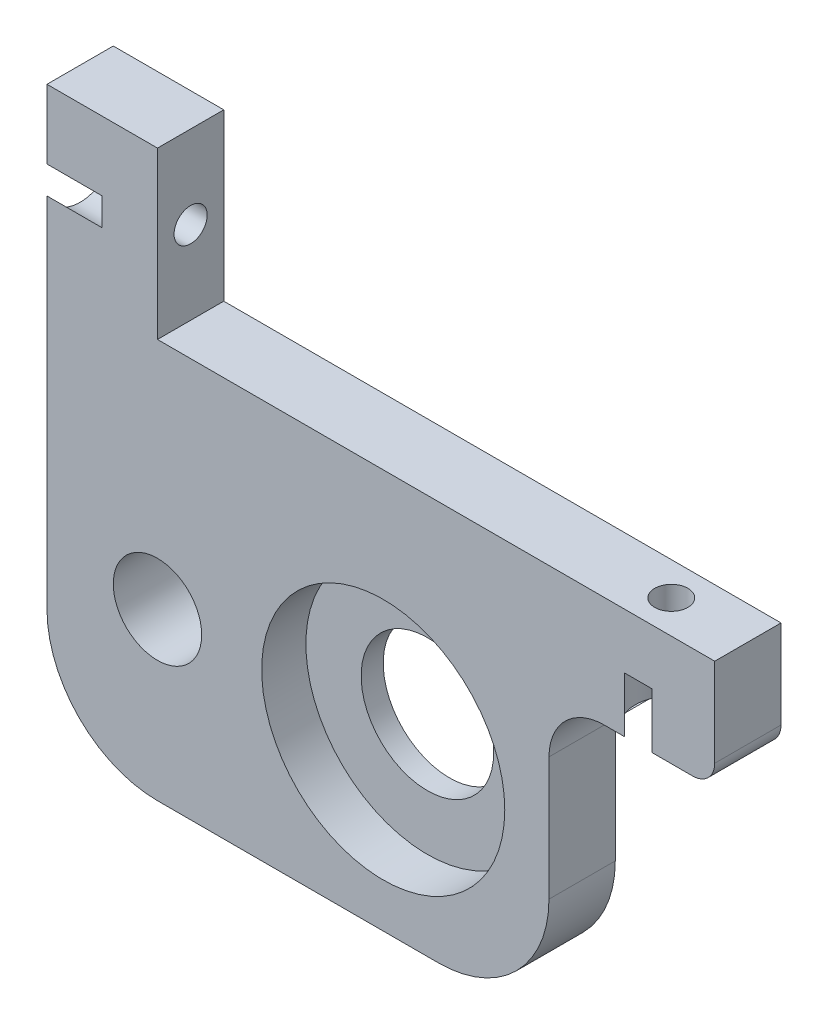
ISO-10303-21;
HEADER;
FILE_DESCRIPTION(('STEP AP214'),'2;1');
FILE_NAME('part.step','',(''),(''),'','','');
FILE_SCHEMA(('AUTOMOTIVE_DESIGN { 1 0 10303 214 1 1 1 1 }'));
ENDSEC;
DATA;
#1=APPLICATION_CONTEXT('core data for automotive mechanical design processes');
#2=APPLICATION_PROTOCOL_DEFINITION('international standard','automotive_design',2000,#1);
#3=PRODUCT_CONTEXT('',#1,'mechanical');
#4=PRODUCT('Part','Part','',(#3));
#5=PRODUCT_RELATED_PRODUCT_CATEGORY('part','',(#4));
#6=PRODUCT_DEFINITION_FORMATION('','',#4);
#7=PRODUCT_DEFINITION_CONTEXT('part definition',#1,'design');
#8=PRODUCT_DEFINITION('design','',#6,#7);
#9=PRODUCT_DEFINITION_SHAPE('','',#8);
#10=(LENGTH_UNIT() NAMED_UNIT(*) SI_UNIT(.MILLI.,.METRE.));
#11=(NAMED_UNIT(*) PLANE_ANGLE_UNIT() SI_UNIT($,.RADIAN.));
#12=(NAMED_UNIT(*) SI_UNIT($,.STERADIAN.) SOLID_ANGLE_UNIT());
#13=UNCERTAINTY_MEASURE_WITH_UNIT(LENGTH_MEASURE(1.E-05),#10,'distance_accuracy_value','');
#14=(GEOMETRIC_REPRESENTATION_CONTEXT(3) GLOBAL_UNCERTAINTY_ASSIGNED_CONTEXT((#13)) GLOBAL_UNIT_ASSIGNED_CONTEXT((#10,
#11,#12)) REPRESENTATION_CONTEXT('',''));
#15=CARTESIAN_POINT('',(0.,0.,0.));
#16=DIRECTION('',(0.,0.,1.));
#17=DIRECTION('',(1.,0.,0.));
#18=AXIS2_PLACEMENT_3D('',#15,#16,#17);
#19=CARTESIAN_POINT('',(-2.,-10.,6.));
#20=DIRECTION('',(0.,-1.,0.));
#21=DIRECTION('',(1.,0.,0.));
#22=AXIS2_PLACEMENT_3D('',#19,#20,#21);
#23=PLANE('',#22);
#24=CARTESIAN_POINT('',(-6.93,-10.,3.));
#25=DIRECTION('',(0.,-1.,0.));
#26=DIRECTION('',(1.,0.,0.));
#27=AXIS2_PLACEMENT_3D('',#24,#25,#26);
#28=CIRCLE('',#27,3.25);
#29=CARTESIAN_POINT('',(-8.18000000000001,-10.,6.));
#30=VERTEX_POINT('',#29);
#31=CARTESIAN_POINT('',(-9.99999999999999,-10.,4.06658333007789));
#32=VERTEX_POINT('',#31);
#33=EDGE_CURVE('E267',#30,#32,#28,.T.);
#34=ORIENTED_EDGE('',*,*,#33,.F.);
#35=DIRECTION('',(-1.,0.,0.));
#36=VECTOR('',#35,1.);
#37=CARTESIAN_POINT('',(-2.,-10.,6.));
#38=LINE('',#37,#36);
#39=CARTESIAN_POINT('',(-9.99999999999999,-10.,6.));
#40=VERTEX_POINT('',#39);
#41=EDGE_CURVE('E284',#30,#40,#38,.T.);
#42=ORIENTED_EDGE('',*,*,#41,.T.);
#43=DIRECTION('',(0.,0.,-1.));
#44=VECTOR('',#43,1.);
#45=CARTESIAN_POINT('',(-9.99999999999999,-10.,6.));
#46=LINE('',#45,#44);
#47=EDGE_CURVE('E371',#40,#32,#46,.T.);
#48=ORIENTED_EDGE('',*,*,#47,.T.);
#49=EDGE_LOOP('',(#34,#42,#48));
#50=FACE_BOUND('',#49,.T.);
#51=ADVANCED_FACE('F113',(#50),#23,.T.);
#52=CARTESIAN_POINT('',(-9.99999999999999,-10.,1.93341666992211));
#53=VERTEX_POINT('',#52);
#54=CARTESIAN_POINT('',(-8.18,-10.,0.));
#55=VERTEX_POINT('',#54);
#56=EDGE_CURVE('E265',#53,#55,#28,.T.);
#57=ORIENTED_EDGE('',*,*,#56,.F.);
#58=CARTESIAN_POINT('',(-9.99999999999999,-10.,0.));
#59=VERTEX_POINT('',#58);
#60=EDGE_CURVE('E370',#53,#59,#46,.T.);
#61=ORIENTED_EDGE('',*,*,#60,.T.);
#62=DIRECTION('',(-1.,0.,0.));
#63=VECTOR('',#62,1.);
#64=CARTESIAN_POINT('',(-2.,-10.,0.));
#65=LINE('',#64,#63);
#66=EDGE_CURVE('E324',#55,#59,#65,.T.);
#67=ORIENTED_EDGE('',*,*,#66,.F.);
#68=EDGE_LOOP('',(#57,#61,#67));
#69=FACE_BOUND('',#68,.T.);
#70=ADVANCED_FACE('F467',(#69),#23,.T.);
#71=CARTESIAN_POINT('',(-6.93,-36.15,3.));
#72=DIRECTION('',(0.,1.,0.));
#73=DIRECTION('',(0.,0.,1.));
#74=AXIS2_PLACEMENT_3D('',#71,#72,#73);
#75=CYLINDRICAL_SURFACE('',#74,1.5);
#76=CARTESIAN_POINT('',(-6.93,0.,3.));
#77=DIRECTION('',(0.,1.,0.));
#78=DIRECTION('',(0.,0.,1.));
#79=AXIS2_PLACEMENT_3D('',#76,#77,#78);
#80=CIRCLE('',#79,1.5);
#81=CARTESIAN_POINT('',(-6.93,0.,4.5));
#82=VERTEX_POINT('',#81);
#83=EDGE_CURVE('E412',#82,#82,#80,.T.);
#84=ORIENTED_EDGE('',*,*,#83,.T.);
#85=EDGE_LOOP('',(#84));
#86=FACE_BOUND('',#85,.T.);
#87=CARTESIAN_POINT('',(-6.93,-5.,3.));
#88=DIRECTION('',(0.,-1.,0.));
#89=DIRECTION('',(1.,0.,0.));
#90=AXIS2_PLACEMENT_3D('',#87,#88,#89);
#91=CIRCLE('',#90,1.5);
#92=CARTESIAN_POINT('',(-5.42999999999999,-5.,3.));
#93=VERTEX_POINT('',#92);
#94=EDGE_CURVE('E117',#93,#93,#91,.F.);
#95=ORIENTED_EDGE('',*,*,#94,.F.);
#96=EDGE_LOOP('',(#95));
#97=FACE_BOUND('',#96,.T.);
#98=ADVANCED_FACE('F534',(#86,#97),#75,.F.);
#99=CARTESIAN_POINT('',(-60.43,-26.15,6.));
#100=DIRECTION('',(-1.,0.,0.));
#101=DIRECTION('',(0.,0.,1.));
#102=AXIS2_PLACEMENT_3D('',#99,#100,#101);
#103=PLANE('',#102);
#104=CARTESIAN_POINT('',(-60.43,7.49999999999998,3.));
#105=DIRECTION('',(-1.,0.,0.));
#106=DIRECTION('',(0.,0.,1.));
#107=AXIS2_PLACEMENT_3D('',#104,#105,#106);
#108=CIRCLE('',#107,3.25);
#109=CARTESIAN_POINT('',(-60.43,8.74999999999998,6.));
#110=VERTEX_POINT('',#109);
#111=CARTESIAN_POINT('',(-60.43,8.74999999999997,0.));
#112=VERTEX_POINT('',#111);
#113=EDGE_CURVE('E394',#110,#112,#108,.T.);
#114=ORIENTED_EDGE('',*,*,#113,.F.);
#115=DIRECTION('',(0.,1.,0.));
#116=VECTOR('',#115,1.);
#117=CARTESIAN_POINT('',(-60.43,-26.15,6.));
#118=LINE('',#117,#116);
#119=CARTESIAN_POINT('',(-60.43,15.,6.));
#120=VERTEX_POINT('',#119);
#121=EDGE_CURVE('E303',#110,#120,#118,.T.);
#122=ORIENTED_EDGE('',*,*,#121,.T.);
#123=DIRECTION('',(0.,0.,-1.));
#124=VECTOR('',#123,1.);
#125=CARTESIAN_POINT('',(-60.43,15.,6.));
#126=LINE('',#125,#124);
#127=CARTESIAN_POINT('',(-60.43,15.,0.));
#128=VERTEX_POINT('',#127);
#129=EDGE_CURVE('E358',#120,#128,#126,.T.);
#130=ORIENTED_EDGE('',*,*,#129,.T.);
#131=DIRECTION('',(0.,1.,0.));
#132=VECTOR('',#131,1.);
#133=CARTESIAN_POINT('',(-60.43,-26.15,0.));
#134=LINE('',#133,#132);
#135=EDGE_CURVE('E342',#112,#128,#134,.T.);
#136=ORIENTED_EDGE('',*,*,#135,.F.);
#137=EDGE_LOOP('',(#114,#122,#130,#136));
#138=FACE_BOUND('',#137,.T.);
#139=ADVANCED_FACE('F514',(#138),#103,.T.);
#140=CARTESIAN_POINT('',(-60.43,7.49999999999995,3.));
#141=DIRECTION('',(1.,0.,0.));
#142=DIRECTION('',(0.,0.,-1.));
#143=AXIS2_PLACEMENT_3D('',#140,#141,#142);
#144=CYLINDRICAL_SURFACE('',#143,1.5);
#145=CARTESIAN_POINT('',(-50.43,7.49999999999995,3.));
#146=DIRECTION('',(1.,0.,0.));
#147=DIRECTION('',(0.,0.,-1.));
#148=AXIS2_PLACEMENT_3D('',#145,#146,#147);
#149=CIRCLE('',#148,1.5);
#150=CARTESIAN_POINT('',(-50.43,7.49999999999995,1.5));
#151=VERTEX_POINT('',#150);
#152=EDGE_CURVE('E409',#151,#151,#149,.T.);
#153=ORIENTED_EDGE('',*,*,#152,.T.);
#154=EDGE_LOOP('',(#153));
#155=FACE_BOUND('',#154,.T.);
#156=CARTESIAN_POINT('',(-55.43,7.49999999999995,3.));
#157=DIRECTION('',(-1.,0.,0.));
#158=DIRECTION('',(0.,0.,1.));
#159=AXIS2_PLACEMENT_3D('',#156,#157,#158);
#160=CIRCLE('',#159,1.5);
#161=CARTESIAN_POINT('',(-55.43,7.49999999999995,4.5));
#162=VERTEX_POINT('',#161);
#163=EDGE_CURVE('E379',#162,#162,#160,.F.);
#164=ORIENTED_EDGE('',*,*,#163,.F.);
#165=EDGE_LOOP('',(#164));
#166=FACE_BOUND('',#165,.T.);
#167=ADVANCED_FACE('F749',(#155,#166),#144,.F.);
#168=CARTESIAN_POINT('',(-30.,-21.15,6.));
#169=DIRECTION('',(0.,0.,-1.));
#170=DIRECTION('',(-1.,0.,0.));
#171=AXIS2_PLACEMENT_3D('',#168,#169,#170);
#172=CYLINDRICAL_SURFACE('',#171,6.);
#173=CARTESIAN_POINT('',(-30.,-21.15,0.));
#174=DIRECTION('',(0.,0.,1.));
#175=DIRECTION('',(1.,0.,0.));
#176=AXIS2_PLACEMENT_3D('',#173,#174,#175);
#177=CIRCLE('',#176,6.);
#178=CARTESIAN_POINT('',(-24.,-21.15,0.));
#179=VERTEX_POINT('',#178);
#180=EDGE_CURVE('E318',#179,#179,#177,.T.);
#181=ORIENTED_EDGE('',*,*,#180,.F.);
#182=EDGE_LOOP('',(#181));
#183=FACE_BOUND('',#182,.T.);
#184=CARTESIAN_POINT('',(-30.,-21.15,2.));
#185=DIRECTION('',(0.,0.,1.));
#186=DIRECTION('',(1.,0.,0.));
#187=AXIS2_PLACEMENT_3D('',#184,#185,#186);
#188=CIRCLE('',#187,6.);
#189=CARTESIAN_POINT('',(-24.,-21.15,2.));
#190=VERTEX_POINT('',#189);
#191=EDGE_CURVE('E375',#190,#190,#188,.T.);
#192=ORIENTED_EDGE('',*,*,#191,.T.);
#193=EDGE_LOOP('',(#192));
#194=FACE_BOUND('',#193,.T.);
#195=ADVANCED_FACE('F556',(#183,#194),#172,.F.);
#196=CARTESIAN_POINT('',(-25.,-26.15,6.));
#197=DIRECTION('',(0.,0.,1.));
#198=DIRECTION('',(1.,0.,0.));
#199=AXIS2_PLACEMENT_3D('',#196,#197,#198);
#200=PLANE('',#199);
#201=DIRECTION('',(0.,-1.,0.));
#202=VECTOR('',#201,1.);
#203=CARTESIAN_POINT('',(-8.18,-5.00000000000001,6.));
#204=LINE('',#203,#202);
#205=CARTESIAN_POINT('',(-8.18,-5.00000000000001,6.));
#206=VERTEX_POINT('',#205);
#207=EDGE_CURVE('E278',#206,#30,#204,.T.);
#208=ORIENTED_EDGE('',*,*,#207,.F.);
#209=DIRECTION('',(1.,0.,0.));
#210=VECTOR('',#209,1.);
#211=CARTESIAN_POINT('',(-25.,-5.,6.));
#212=LINE('',#211,#210);
#213=CARTESIAN_POINT('',(-5.67999999999999,-5.00000000000001,6.));
#214=VERTEX_POINT('',#213);
#215=EDGE_CURVE('E277',#206,#214,#212,.T.);
#216=ORIENTED_EDGE('',*,*,#215,.T.);
#217=DIRECTION('',(0.,-1.,0.));
#218=VECTOR('',#217,1.);
#219=CARTESIAN_POINT('',(-5.67999999999999,-5.00000000000001,6.));
#220=LINE('',#219,#218);
#221=CARTESIAN_POINT('',(-5.67999999999999,-10.,6.));
#222=VERTEX_POINT('',#221);
#223=EDGE_CURVE('E259',#222,#214,#220,.F.);
#224=ORIENTED_EDGE('',*,*,#223,.F.);
#225=CARTESIAN_POINT('',(-2.,-10.,6.));
#226=VERTEX_POINT('',#225);
#227=EDGE_CURVE('E275',#226,#222,#38,.T.);
#228=ORIENTED_EDGE('',*,*,#227,.F.);
#229=CARTESIAN_POINT('',(-2.,-8.00000000000001,6.));
#230=DIRECTION('',(0.,0.,-1.));
#231=DIRECTION('',(-1.,0.,0.));
#232=AXIS2_PLACEMENT_3D('',#229,#230,#231);
#233=CIRCLE('',#232,2.);
#234=CARTESIAN_POINT('',(0.,-8.00000000000001,6.));
#235=VERTEX_POINT('',#234);
#236=EDGE_CURVE('E283',#235,#226,#233,.T.);
#237=ORIENTED_EDGE('',*,*,#236,.F.);
#238=DIRECTION('',(0.,-1.,0.));
#239=VECTOR('',#238,1.);
#240=CARTESIAN_POINT('',(0.,0.,6.));
#241=LINE('',#240,#239);
#242=CARTESIAN_POINT('',(0.,0.,6.));
#243=VERTEX_POINT('',#242);
#244=EDGE_CURVE('E286',#243,#235,#241,.T.);
#245=ORIENTED_EDGE('',*,*,#244,.F.);
#246=DIRECTION('',(1.,0.,0.));
#247=VECTOR('',#246,1.);
#248=CARTESIAN_POINT('',(-50.43,0.,6.));
#249=LINE('',#248,#247);
#250=CARTESIAN_POINT('',(-50.43,0.,6.));
#251=VERTEX_POINT('',#250);
#252=EDGE_CURVE('E294',#251,#243,#249,.T.);
#253=ORIENTED_EDGE('',*,*,#252,.F.);
#254=DIRECTION('',(0.,-1.,0.));
#255=VECTOR('',#254,1.);
#256=CARTESIAN_POINT('',(-50.43,15.,6.));
#257=LINE('',#256,#255);
#258=CARTESIAN_POINT('',(-50.43,15.,6.));
#259=VERTEX_POINT('',#258);
#260=EDGE_CURVE('E297',#259,#251,#257,.T.);
#261=ORIENTED_EDGE('',*,*,#260,.F.);
#262=DIRECTION('',(1.,0.,0.));
#263=VECTOR('',#262,1.);
#264=CARTESIAN_POINT('',(-60.43,15.,6.));
#265=LINE('',#264,#263);
#266=EDGE_CURVE('E300',#120,#259,#265,.T.);
#267=ORIENTED_EDGE('',*,*,#266,.F.);
#268=ORIENTED_EDGE('',*,*,#121,.F.);
#269=DIRECTION('',(-1.,0.,0.));
#270=VECTOR('',#269,1.);
#271=CARTESIAN_POINT('',(-55.43,8.74999999999998,6.));
#272=LINE('',#271,#270);
#273=CARTESIAN_POINT('',(-55.43,8.74999999999998,6.));
#274=VERTEX_POINT('',#273);
#275=EDGE_CURVE('E407',#274,#110,#272,.T.);
#276=ORIENTED_EDGE('',*,*,#275,.F.);
#277=DIRECTION('',(0.,-1.,0.));
#278=VECTOR('',#277,1.);
#279=CARTESIAN_POINT('',(-55.43,-26.15,6.));
#280=LINE('',#279,#278);
#281=CARTESIAN_POINT('',(-55.43,6.24999999999997,6.));
#282=VERTEX_POINT('',#281);
#283=EDGE_CURVE('E385',#274,#282,#280,.T.);
#284=ORIENTED_EDGE('',*,*,#283,.T.);
#285=DIRECTION('',(-1.,0.,0.));
#286=VECTOR('',#285,1.);
#287=CARTESIAN_POINT('',(-55.43,6.24999999999997,6.));
#288=LINE('',#287,#286);
#289=CARTESIAN_POINT('',(-60.43,6.24999999999997,6.));
#290=VERTEX_POINT('',#289);
#291=EDGE_CURVE('E405',#290,#282,#288,.F.);
#292=ORIENTED_EDGE('',*,*,#291,.F.);
#293=CARTESIAN_POINT('',(-60.43,-26.15,6.));
#294=VERTEX_POINT('',#293);
#295=EDGE_CURVE('E304',#294,#290,#118,.T.);
#296=ORIENTED_EDGE('',*,*,#295,.F.);
#297=CARTESIAN_POINT('',(-50.43,-26.15,6.));
#298=DIRECTION('',(0.,0.,-1.));
#299=DIRECTION('',(-1.,0.,0.));
#300=AXIS2_PLACEMENT_3D('',#297,#298,#299);
#301=CIRCLE('',#300,10.);
#302=CARTESIAN_POINT('',(-50.43,-36.15,6.));
#303=VERTEX_POINT('',#302);
#304=EDGE_CURVE('E307',#303,#294,#301,.T.);
#305=ORIENTED_EDGE('',*,*,#304,.F.);
#306=DIRECTION('',(-1.,0.,0.));
#307=VECTOR('',#306,1.);
#308=CARTESIAN_POINT('',(-25.,-36.15,6.));
#309=LINE('',#308,#307);
#310=CARTESIAN_POINT('',(-25.,-36.15,6.));
#311=VERTEX_POINT('',#310);
#312=EDGE_CURVE('E310',#311,#303,#309,.T.);
#313=ORIENTED_EDGE('',*,*,#312,.F.);
#314=CARTESIAN_POINT('',(-25.,-26.15,6.));
#315=DIRECTION('',(0.,0.,1.));
#316=DIRECTION('',(1.,0.,0.));
#317=AXIS2_PLACEMENT_3D('',#314,#315,#316);
#318=CIRCLE('',#317,10.);
#319=CARTESIAN_POINT('',(-15.,-26.15,6.));
#320=VERTEX_POINT('',#319);
#321=EDGE_CURVE('E352',#311,#320,#318,.T.);
#322=ORIENTED_EDGE('',*,*,#321,.T.);
#323=DIRECTION('',(0.,-1.,0.));
#324=VECTOR('',#323,1.);
#325=CARTESIAN_POINT('',(-15.,-15.,6.));
#326=LINE('',#325,#324);
#327=CARTESIAN_POINT('',(-15.,-15.,6.));
#328=VERTEX_POINT('',#327);
#329=EDGE_CURVE('E427',#328,#320,#326,.T.);
#330=ORIENTED_EDGE('',*,*,#329,.F.);
#331=CARTESIAN_POINT('',(-9.99999999999999,-15.,6.));
#332=DIRECTION('',(0.,0.,-1.));
#333=DIRECTION('',(-1.,0.,0.));
#334=AXIS2_PLACEMENT_3D('',#331,#332,#333);
#335=CIRCLE('',#334,5.);
#336=EDGE_CURVE('E288',#328,#40,#335,.T.);
#337=ORIENTED_EDGE('',*,*,#336,.T.);
#338=ORIENTED_EDGE('',*,*,#41,.F.);
#339=EDGE_LOOP('',(#208,#216,#224,#228,#237,#245,#253,#261,#267,#268,#276,#284,#292,#296,#305,
#313,#322,#330,#337,#338));
#340=FACE_BOUND('',#339,.T.);
#341=CARTESIAN_POINT('',(-30.,-21.15,6.));
#342=DIRECTION('',(0.,0.,1.));
#343=DIRECTION('',(1.,0.,0.));
#344=AXIS2_PLACEMENT_3D('',#341,#342,#343);
#345=CIRCLE('',#344,11.);
#346=CARTESIAN_POINT('',(-19.,-21.15,6.));
#347=VERTEX_POINT('',#346);
#348=EDGE_CURVE('E415',#347,#347,#345,.T.);
#349=ORIENTED_EDGE('',*,*,#348,.F.);
#350=EDGE_LOOP('',(#349));
#351=FACE_BOUND('',#350,.T.);
#352=CARTESIAN_POINT('',(-50.43,-21.15,6.));
#353=DIRECTION('',(0.,0.,1.));
#354=DIRECTION('',(1.,0.,0.));
#355=AXIS2_PLACEMENT_3D('',#352,#353,#354);
#356=CIRCLE('',#355,4.00000000000001);
#357=CARTESIAN_POINT('',(-46.43,-21.15,6.));
#358=VERTEX_POINT('',#357);
#359=EDGE_CURVE('E420',#358,#358,#356,.T.);
#360=ORIENTED_EDGE('',*,*,#359,.F.);
#361=EDGE_LOOP('',(#360));
#362=FACE_BOUND('',#361,.T.);
#363=ADVANCED_FACE('F272',(#340,#351,#362),#200,.T.);
#364=CARTESIAN_POINT('',(-25.,-26.15,0.));
#365=DIRECTION('',(0.,0.,1.));
#366=DIRECTION('',(1.,0.,0.));
#367=AXIS2_PLACEMENT_3D('',#364,#365,#366);
#368=PLANE('',#367);
#369=ORIENTED_EDGE('',*,*,#180,.T.);
#370=EDGE_LOOP('',(#369));
#371=FACE_BOUND('',#370,.T.);
#372=DIRECTION('',(1.,0.,0.));
#373=VECTOR('',#372,1.);
#374=CARTESIAN_POINT('',(-25.,-5.,0.));
#375=LINE('',#374,#373);
#376=CARTESIAN_POINT('',(-8.18,-5.00000000000001,0.));
#377=VERTEX_POINT('',#376);
#378=CARTESIAN_POINT('',(-5.67999999999999,-5.00000000000001,0.));
#379=VERTEX_POINT('',#378);
#380=EDGE_CURVE('E451',#377,#379,#375,.T.);
#381=ORIENTED_EDGE('',*,*,#380,.F.);
#382=DIRECTION('',(0.,-1.,0.));
#383=VECTOR('',#382,1.);
#384=CARTESIAN_POINT('',(-8.18,-5.00000000000001,0.));
#385=LINE('',#384,#383);
#386=EDGE_CURVE('E279',#377,#55,#385,.T.);
#387=ORIENTED_EDGE('',*,*,#386,.T.);
#388=ORIENTED_EDGE('',*,*,#66,.T.);
#389=CARTESIAN_POINT('',(-9.99999999999999,-15.,0.));
#390=DIRECTION('',(0.,0.,-1.));
#391=DIRECTION('',(-1.,0.,0.));
#392=AXIS2_PLACEMENT_3D('',#389,#390,#391);
#393=CIRCLE('',#392,5.);
#394=CARTESIAN_POINT('',(-15.,-15.,0.));
#395=VERTEX_POINT('',#394);
#396=EDGE_CURVE('E321',#395,#59,#393,.T.);
#397=ORIENTED_EDGE('',*,*,#396,.F.);
#398=DIRECTION('',(0.,-1.,0.));
#399=VECTOR('',#398,1.);
#400=CARTESIAN_POINT('',(-15.,-15.,0.));
#401=LINE('',#400,#399);
#402=CARTESIAN_POINT('',(-15.,-26.15,0.));
#403=VERTEX_POINT('',#402);
#404=EDGE_CURVE('E317',#395,#403,#401,.T.);
#405=ORIENTED_EDGE('',*,*,#404,.T.);
#406=CARTESIAN_POINT('',(-25.,-26.15,0.));
#407=DIRECTION('',(0.,0.,1.));
#408=DIRECTION('',(1.,0.,0.));
#409=AXIS2_PLACEMENT_3D('',#406,#407,#408);
#410=CIRCLE('',#409,10.);
#411=CARTESIAN_POINT('',(-25.,-36.15,0.));
#412=VERTEX_POINT('',#411);
#413=EDGE_CURVE('E314',#412,#403,#410,.T.);
#414=ORIENTED_EDGE('',*,*,#413,.F.);
#415=DIRECTION('',(-1.,0.,0.));
#416=VECTOR('',#415,1.);
#417=CARTESIAN_POINT('',(-25.,-36.15,0.));
#418=LINE('',#417,#416);
#419=CARTESIAN_POINT('',(-50.43,-36.15,0.));
#420=VERTEX_POINT('',#419);
#421=EDGE_CURVE('E349',#412,#420,#418,.T.);
#422=ORIENTED_EDGE('',*,*,#421,.T.);
#423=CARTESIAN_POINT('',(-50.43,-26.15,0.));
#424=DIRECTION('',(0.,0.,-1.));
#425=DIRECTION('',(-1.,0.,0.));
#426=AXIS2_PLACEMENT_3D('',#423,#424,#425);
#427=CIRCLE('',#426,10.);
#428=CARTESIAN_POINT('',(-60.43,-26.15,0.));
#429=VERTEX_POINT('',#428);
#430=EDGE_CURVE('E346',#420,#429,#427,.T.);
#431=ORIENTED_EDGE('',*,*,#430,.T.);
#432=CARTESIAN_POINT('',(-60.43,6.24999999999998,0.));
#433=VERTEX_POINT('',#432);
#434=EDGE_CURVE('E343',#429,#433,#134,.T.);
#435=ORIENTED_EDGE('',*,*,#434,.T.);
#436=DIRECTION('',(-1.,0.,0.));
#437=VECTOR('',#436,1.);
#438=CARTESIAN_POINT('',(-55.43,6.24999999999998,0.));
#439=LINE('',#438,#437);
#440=CARTESIAN_POINT('',(-55.43,6.24999999999998,0.));
#441=VERTEX_POINT('',#440);
#442=EDGE_CURVE('E138',#433,#441,#439,.F.);
#443=ORIENTED_EDGE('',*,*,#442,.T.);
#444=DIRECTION('',(0.,-1.,0.));
#445=VECTOR('',#444,1.);
#446=CARTESIAN_POINT('',(-55.43,-26.15,0.));
#447=LINE('',#446,#445);
#448=CARTESIAN_POINT('',(-55.43,8.74999999999997,0.));
#449=VERTEX_POINT('',#448);
#450=EDGE_CURVE('E381',#449,#441,#447,.T.);
#451=ORIENTED_EDGE('',*,*,#450,.F.);
#452=DIRECTION('',(-1.,0.,0.));
#453=VECTOR('',#452,1.);
#454=CARTESIAN_POINT('',(-55.43,8.74999999999997,0.));
#455=LINE('',#454,#453);
#456=EDGE_CURVE('E402',#449,#112,#455,.T.);
#457=ORIENTED_EDGE('',*,*,#456,.T.);
#458=ORIENTED_EDGE('',*,*,#135,.T.);
#459=DIRECTION('',(1.,0.,0.));
#460=VECTOR('',#459,1.);
#461=CARTESIAN_POINT('',(-60.43,15.,0.));
#462=LINE('',#461,#460);
#463=CARTESIAN_POINT('',(-50.43,15.,0.));
#464=VERTEX_POINT('',#463);
#465=EDGE_CURVE('E339',#128,#464,#462,.T.);
#466=ORIENTED_EDGE('',*,*,#465,.T.);
#467=DIRECTION('',(0.,-1.,0.));
#468=VECTOR('',#467,1.);
#469=CARTESIAN_POINT('',(-50.43,15.,0.));
#470=LINE('',#469,#468);
#471=CARTESIAN_POINT('',(-50.43,0.,0.));
#472=VERTEX_POINT('',#471);
#473=EDGE_CURVE('E336',#464,#472,#470,.T.);
#474=ORIENTED_EDGE('',*,*,#473,.T.);
#475=DIRECTION('',(1.,0.,0.));
#476=VECTOR('',#475,1.);
#477=CARTESIAN_POINT('',(-50.43,0.,0.));
#478=LINE('',#477,#476);
#479=CARTESIAN_POINT('',(0.,0.,0.));
#480=VERTEX_POINT('',#479);
#481=EDGE_CURVE('E333',#472,#480,#478,.T.);
#482=ORIENTED_EDGE('',*,*,#481,.T.);
#483=DIRECTION('',(0.,-1.,0.));
#484=VECTOR('',#483,1.);
#485=CARTESIAN_POINT('',(0.,0.,0.));
#486=LINE('',#485,#484);
#487=CARTESIAN_POINT('',(0.,-8.00000000000001,0.));
#488=VERTEX_POINT('',#487);
#489=EDGE_CURVE('E330',#480,#488,#486,.T.);
#490=ORIENTED_EDGE('',*,*,#489,.T.);
#491=CARTESIAN_POINT('',(-2.,-8.00000000000001,0.));
#492=DIRECTION('',(0.,0.,-1.));
#493=DIRECTION('',(-1.,0.,0.));
#494=AXIS2_PLACEMENT_3D('',#491,#492,#493);
#495=CIRCLE('',#494,2.);
#496=CARTESIAN_POINT('',(-2.,-10.,0.));
#497=VERTEX_POINT('',#496);
#498=EDGE_CURVE('E327',#488,#497,#495,.T.);
#499=ORIENTED_EDGE('',*,*,#498,.T.);
#500=CARTESIAN_POINT('',(-5.68,-10.,0.));
#501=VERTEX_POINT('',#500);
#502=EDGE_CURVE('E325',#497,#501,#65,.T.);
#503=ORIENTED_EDGE('',*,*,#502,.T.);
#504=DIRECTION('',(0.,-1.,0.));
#505=VECTOR('',#504,1.);
#506=CARTESIAN_POINT('',(-5.67999999999999,-5.00000000000001,0.));
#507=LINE('',#506,#505);
#508=EDGE_CURVE('E130',#501,#379,#507,.F.);
#509=ORIENTED_EDGE('',*,*,#508,.T.);
#510=EDGE_LOOP('',(#381,#387,#388,#397,#405,#414,#422,#431,#435,#443,#451,#457,#458,#466,#474,
#482,#490,#499,#503,#509));
#511=FACE_BOUND('',#510,.T.);
#512=CARTESIAN_POINT('',(-50.43,-21.15,0.));
#513=DIRECTION('',(0.,0.,1.));
#514=DIRECTION('',(1.,0.,0.));
#515=AXIS2_PLACEMENT_3D('',#512,#513,#514);
#516=CIRCLE('',#515,4.00000000000001);
#517=CARTESIAN_POINT('',(-46.43,-21.15,0.));
#518=VERTEX_POINT('',#517);
#519=EDGE_CURVE('E377',#518,#518,#516,.T.);
#520=ORIENTED_EDGE('',*,*,#519,.T.);
#521=EDGE_LOOP('',(#520));
#522=FACE_BOUND('',#521,.T.);
#523=ADVANCED_FACE('F460',(#371,#511,#522),#368,.F.);
#524=CARTESIAN_POINT('',(-25.,-26.15,6.));
#525=DIRECTION('',(0.,0.,-1.));
#526=DIRECTION('',(-1.,0.,0.));
#527=AXIS2_PLACEMENT_3D('',#524,#525,#526);
#528=CYLINDRICAL_SURFACE('',#527,10.);
#529=ORIENTED_EDGE('',*,*,#413,.T.);
#530=DIRECTION('',(0.,0.,-1.));
#531=VECTOR('',#530,1.);
#532=CARTESIAN_POINT('',(-15.,-26.15,6.));
#533=LINE('',#532,#531);
#534=EDGE_CURVE('E12',#320,#403,#533,.T.);
#535=ORIENTED_EDGE('',*,*,#534,.F.);
#536=ORIENTED_EDGE('',*,*,#321,.F.);
#537=DIRECTION('',(0.,0.,-1.));
#538=VECTOR('',#537,1.);
#539=CARTESIAN_POINT('',(-25.,-36.15,6.));
#540=LINE('',#539,#538);
#541=EDGE_CURVE('E313',#311,#412,#540,.T.);
#542=ORIENTED_EDGE('',*,*,#541,.T.);
#543=EDGE_LOOP('',(#529,#535,#536,#542));
#544=FACE_BOUND('',#543,.T.);
#545=ADVANCED_FACE('F115',(#544),#528,.T.);
#546=CARTESIAN_POINT('',(-15.,-15.,6.));
#547=DIRECTION('',(1.,0.,0.));
#548=DIRECTION('',(0.,1.,0.));
#549=AXIS2_PLACEMENT_3D('',#546,#547,#548);
#550=PLANE('',#549);
#551=ORIENTED_EDGE('',*,*,#404,.F.);
#552=DIRECTION('',(0.,0.,-1.));
#553=VECTOR('',#552,1.);
#554=CARTESIAN_POINT('',(-15.,-15.,6.));
#555=LINE('',#554,#553);
#556=EDGE_CURVE('E122',#328,#395,#555,.T.);
#557=ORIENTED_EDGE('',*,*,#556,.F.);
#558=ORIENTED_EDGE('',*,*,#329,.T.);
#559=ORIENTED_EDGE('',*,*,#534,.T.);
#560=EDGE_LOOP('',(#551,#557,#558,#559));
#561=FACE_BOUND('',#560,.T.);
#562=ADVANCED_FACE('F470',(#561),#550,.T.);
#563=CARTESIAN_POINT('',(-9.99999999999999,-15.,6.));
#564=DIRECTION('',(0.,0.,-1.));
#565=DIRECTION('',(-1.,0.,0.));
#566=AXIS2_PLACEMENT_3D('',#563,#564,#565);
#567=CYLINDRICAL_SURFACE('',#566,5.);
#568=ORIENTED_EDGE('',*,*,#396,.T.);
#569=ORIENTED_EDGE('',*,*,#60,.F.);
#570=DIRECTION('',(0.,0.,-1.));
#571=VECTOR('',#570,1.);
#572=CARTESIAN_POINT('',(-9.99999999999999,-10.,6.));
#573=LINE('',#572,#571);
#574=EDGE_CURVE('E439',#53,#32,#573,.F.);
#575=ORIENTED_EDGE('',*,*,#574,.T.);
#576=ORIENTED_EDGE('',*,*,#47,.F.);
#577=ORIENTED_EDGE('',*,*,#336,.F.);
#578=ORIENTED_EDGE('',*,*,#556,.T.);
#579=EDGE_LOOP('',(#568,#569,#575,#576,#577,#578));
#580=FACE_BOUND('',#579,.T.);
#581=ADVANCED_FACE('F437',(#580),#567,.F.);
#582=EDGE_CURVE('E256',#501,#222,#28,.T.);
#583=ORIENTED_EDGE('',*,*,#582,.F.);
#584=ORIENTED_EDGE('',*,*,#502,.F.);
#585=DIRECTION('',(0.,0.,-1.));
#586=VECTOR('',#585,1.);
#587=CARTESIAN_POINT('',(-2.,-10.,6.));
#588=LINE('',#587,#586);
#589=EDGE_CURVE('E282',#226,#497,#588,.T.);
#590=ORIENTED_EDGE('',*,*,#589,.F.);
#591=ORIENTED_EDGE('',*,*,#227,.T.);
#592=EDGE_LOOP('',(#583,#584,#590,#591));
#593=FACE_BOUND('',#592,.T.);
#594=ADVANCED_FACE('F281',(#593),#23,.T.);
#595=CARTESIAN_POINT('',(-2.,-8.00000000000001,6.));
#596=DIRECTION('',(0.,0.,-1.));
#597=DIRECTION('',(-1.,0.,0.));
#598=AXIS2_PLACEMENT_3D('',#595,#596,#597);
#599=CYLINDRICAL_SURFACE('',#598,2.);
#600=ORIENTED_EDGE('',*,*,#498,.F.);
#601=DIRECTION('',(0.,0.,-1.));
#602=VECTOR('',#601,1.);
#603=CARTESIAN_POINT('',(0.,-8.00000000000001,6.));
#604=LINE('',#603,#602);
#605=EDGE_CURVE('E367',#235,#488,#604,.T.);
#606=ORIENTED_EDGE('',*,*,#605,.F.);
#607=ORIENTED_EDGE('',*,*,#236,.T.);
#608=ORIENTED_EDGE('',*,*,#589,.T.);
#609=EDGE_LOOP('',(#600,#606,#607,#608));
#610=FACE_BOUND('',#609,.T.);
#611=ADVANCED_FACE('F493',(#610),#599,.T.);
#612=CARTESIAN_POINT('',(0.,0.,6.));
#613=DIRECTION('',(1.,0.,0.));
#614=DIRECTION('',(0.,0.,-1.));
#615=AXIS2_PLACEMENT_3D('',#612,#613,#614);
#616=PLANE('',#615);
#617=ORIENTED_EDGE('',*,*,#489,.F.);
#618=DIRECTION('',(0.,0.,-1.));
#619=VECTOR('',#618,1.);
#620=CARTESIAN_POINT('',(0.,0.,6.));
#621=LINE('',#620,#619);
#622=EDGE_CURVE('E365',#243,#480,#621,.T.);
#623=ORIENTED_EDGE('',*,*,#622,.F.);
#624=ORIENTED_EDGE('',*,*,#244,.T.);
#625=ORIENTED_EDGE('',*,*,#605,.T.);
#626=EDGE_LOOP('',(#617,#623,#624,#625));
#627=FACE_BOUND('',#626,.T.);
#628=ADVANCED_FACE('F497',(#627),#616,.T.);
#629=CARTESIAN_POINT('',(-50.43,0.,6.));
#630=DIRECTION('',(0.,1.,0.));
#631=DIRECTION('',(0.,0.,1.));
#632=AXIS2_PLACEMENT_3D('',#629,#630,#631);
#633=PLANE('',#632);
#634=ORIENTED_EDGE('',*,*,#83,.F.);
#635=EDGE_LOOP('',(#634));
#636=FACE_BOUND('',#635,.T.);
#637=ORIENTED_EDGE('',*,*,#481,.F.);
#638=DIRECTION('',(0.,0.,-1.));
#639=VECTOR('',#638,1.);
#640=CARTESIAN_POINT('',(-50.43,0.,6.));
#641=LINE('',#640,#639);
#642=EDGE_CURVE('E363',#251,#472,#641,.T.);
#643=ORIENTED_EDGE('',*,*,#642,.F.);
#644=ORIENTED_EDGE('',*,*,#252,.T.);
#645=ORIENTED_EDGE('',*,*,#622,.T.);
#646=EDGE_LOOP('',(#637,#643,#644,#645));
#647=FACE_BOUND('',#646,.T.);
#648=ADVANCED_FACE('F500',(#636,#647),#633,.T.);
#649=CARTESIAN_POINT('',(-50.43,15.,6.));
#650=DIRECTION('',(1.,0.,0.));
#651=DIRECTION('',(0.,1.,0.));
#652=AXIS2_PLACEMENT_3D('',#649,#650,#651);
#653=PLANE('',#652);
#654=ORIENTED_EDGE('',*,*,#152,.F.);
#655=EDGE_LOOP('',(#654));
#656=FACE_BOUND('',#655,.T.);
#657=ORIENTED_EDGE('',*,*,#473,.F.);
#658=DIRECTION('',(0.,0.,-1.));
#659=VECTOR('',#658,1.);
#660=CARTESIAN_POINT('',(-50.43,15.,6.));
#661=LINE('',#660,#659);
#662=EDGE_CURVE('E361',#259,#464,#661,.T.);
#663=ORIENTED_EDGE('',*,*,#662,.F.);
#664=ORIENTED_EDGE('',*,*,#260,.T.);
#665=ORIENTED_EDGE('',*,*,#642,.T.);
#666=EDGE_LOOP('',(#657,#663,#664,#665));
#667=FACE_BOUND('',#666,.T.);
#668=ADVANCED_FACE('F505',(#656,#667),#653,.T.);
#669=CARTESIAN_POINT('',(-60.43,15.,6.));
#670=DIRECTION('',(0.,1.,0.));
#671=DIRECTION('',(0.,0.,1.));
#672=AXIS2_PLACEMENT_3D('',#669,#670,#671);
#673=PLANE('',#672);
#674=ORIENTED_EDGE('',*,*,#465,.F.);
#675=ORIENTED_EDGE('',*,*,#129,.F.);
#676=ORIENTED_EDGE('',*,*,#266,.T.);
#677=ORIENTED_EDGE('',*,*,#662,.T.);
#678=EDGE_LOOP('',(#674,#675,#676,#677));
#679=FACE_BOUND('',#678,.T.);
#680=ADVANCED_FACE('F508',(#679),#673,.T.);
#681=EDGE_CURVE('E397',#433,#290,#108,.T.);
#682=ORIENTED_EDGE('',*,*,#681,.F.);
#683=ORIENTED_EDGE('',*,*,#434,.F.);
#684=DIRECTION('',(0.,0.,-1.));
#685=VECTOR('',#684,1.);
#686=CARTESIAN_POINT('',(-60.43,-26.15,6.));
#687=LINE('',#686,#685);
#688=EDGE_CURVE('E356',#294,#429,#687,.T.);
#689=ORIENTED_EDGE('',*,*,#688,.F.);
#690=ORIENTED_EDGE('',*,*,#295,.T.);
#691=EDGE_LOOP('',(#682,#683,#689,#690));
#692=FACE_BOUND('',#691,.T.);
#693=ADVANCED_FACE('F484',(#692),#103,.T.);
#694=CARTESIAN_POINT('',(-50.43,-26.15,6.));
#695=DIRECTION('',(0.,0.,-1.));
#696=DIRECTION('',(-1.,0.,0.));
#697=AXIS2_PLACEMENT_3D('',#694,#695,#696);
#698=CYLINDRICAL_SURFACE('',#697,10.);
#699=ORIENTED_EDGE('',*,*,#430,.F.);
#700=DIRECTION('',(0.,0.,-1.));
#701=VECTOR('',#700,1.);
#702=CARTESIAN_POINT('',(-50.43,-36.15,6.));
#703=LINE('',#702,#701);
#704=EDGE_CURVE('E354',#303,#420,#703,.T.);
#705=ORIENTED_EDGE('',*,*,#704,.F.);
#706=ORIENTED_EDGE('',*,*,#304,.T.);
#707=ORIENTED_EDGE('',*,*,#688,.T.);
#708=EDGE_LOOP('',(#699,#705,#706,#707));
#709=FACE_BOUND('',#708,.T.);
#710=ADVANCED_FACE('F481',(#709),#698,.T.);
#711=CARTESIAN_POINT('',(-25.,-36.15,6.));
#712=DIRECTION('',(0.,-1.,0.));
#713=DIRECTION('',(0.,0.,-1.));
#714=AXIS2_PLACEMENT_3D('',#711,#712,#713);
#715=PLANE('',#714);
#716=ORIENTED_EDGE('',*,*,#421,.F.);
#717=ORIENTED_EDGE('',*,*,#541,.F.);
#718=ORIENTED_EDGE('',*,*,#312,.T.);
#719=ORIENTED_EDGE('',*,*,#704,.T.);
#720=EDGE_LOOP('',(#716,#717,#718,#719));
#721=FACE_BOUND('',#720,.T.);
#722=ADVANCED_FACE('F476',(#721),#715,.T.);
#723=CARTESIAN_POINT('',(-50.43,-21.15,6.));
#724=DIRECTION('',(0.,0.,-1.));
#725=DIRECTION('',(-1.,0.,0.));
#726=AXIS2_PLACEMENT_3D('',#723,#724,#725);
#727=CYLINDRICAL_SURFACE('',#726,4.00000000000001);
#728=ORIENTED_EDGE('',*,*,#359,.T.);
#729=EDGE_LOOP('',(#728));
#730=FACE_BOUND('',#729,.T.);
#731=ORIENTED_EDGE('',*,*,#519,.F.);
#732=EDGE_LOOP('',(#731));
#733=FACE_BOUND('',#732,.T.);
#734=ADVANCED_FACE('F562',(#730,#733),#727,.F.);
#735=CARTESIAN_POINT('',(-30.,-21.15,2.));
#736=DIRECTION('',(0.,0.,1.));
#737=DIRECTION('',(1.,0.,0.));
#738=AXIS2_PLACEMENT_3D('',#735,#736,#737);
#739=CYLINDRICAL_SURFACE('',#738,11.);
#740=CARTESIAN_POINT('',(-30.,-21.15,2.));
#741=DIRECTION('',(0.,0.,1.));
#742=DIRECTION('',(1.,0.,0.));
#743=AXIS2_PLACEMENT_3D('',#740,#741,#742);
#744=CIRCLE('',#743,11.);
#745=CARTESIAN_POINT('',(-19.,-21.15,2.));
#746=VERTEX_POINT('',#745);
#747=EDGE_CURVE('E378',#746,#746,#744,.T.);
#748=ORIENTED_EDGE('',*,*,#747,.F.);
#749=EDGE_LOOP('',(#748));
#750=FACE_BOUND('',#749,.T.);
#751=ORIENTED_EDGE('',*,*,#348,.T.);
#752=EDGE_LOOP('',(#751));
#753=FACE_BOUND('',#752,.T.);
#754=ADVANCED_FACE('F614',(#750,#753),#739,.F.);
#755=CARTESIAN_POINT('',(-30.,-21.15,2.));
#756=DIRECTION('',(0.,0.,1.));
#757=DIRECTION('',(1.,0.,0.));
#758=AXIS2_PLACEMENT_3D('',#755,#756,#757);
#759=PLANE('',#758);
#760=ORIENTED_EDGE('',*,*,#191,.F.);
#761=EDGE_LOOP('',(#760));
#762=FACE_BOUND('',#761,.T.);
#763=ORIENTED_EDGE('',*,*,#747,.T.);
#764=EDGE_LOOP('',(#763));
#765=FACE_BOUND('',#764,.T.);
#766=ADVANCED_FACE('F527',(#762,#765),#759,.T.);
#767=CARTESIAN_POINT('',(-55.43,7.49999999999998,3.));
#768=DIRECTION('',(-1.,0.,0.));
#769=DIRECTION('',(0.,0.,1.));
#770=AXIS2_PLACEMENT_3D('',#767,#768,#769);
#771=CYLINDRICAL_SURFACE('',#770,3.25);
#772=ORIENTED_EDGE('',*,*,#275,.T.);
#773=ORIENTED_EDGE('',*,*,#113,.T.);
#774=ORIENTED_EDGE('',*,*,#456,.F.);
#775=CARTESIAN_POINT('',(-55.43,7.49999999999998,3.));
#776=DIRECTION('',(-1.,0.,0.));
#777=DIRECTION('',(0.,0.,1.));
#778=AXIS2_PLACEMENT_3D('',#775,#776,#777);
#779=CIRCLE('',#778,3.25);
#780=EDGE_CURVE('E382',#274,#449,#779,.T.);
#781=ORIENTED_EDGE('',*,*,#780,.F.);
#782=EDGE_LOOP('',(#772,#773,#774,#781));
#783=FACE_BOUND('',#782,.T.);
#784=ADVANCED_FACE('F517',(#783),#771,.F.);
#785=ORIENTED_EDGE('',*,*,#291,.T.);
#786=EDGE_CURVE('E388',#441,#282,#779,.T.);
#787=ORIENTED_EDGE('',*,*,#786,.F.);
#788=ORIENTED_EDGE('',*,*,#442,.F.);
#789=ORIENTED_EDGE('',*,*,#681,.T.);
#790=EDGE_LOOP('',(#785,#787,#788,#789));
#791=FACE_BOUND('',#790,.T.);
#792=ADVANCED_FACE('F519',(#791),#771,.F.);
#793=CARTESIAN_POINT('',(-55.43,7.49999999999998,3.));
#794=DIRECTION('',(-1.,0.,0.));
#795=DIRECTION('',(0.,0.,1.));
#796=AXIS2_PLACEMENT_3D('',#793,#794,#795);
#797=PLANE('',#796);
#798=ORIENTED_EDGE('',*,*,#163,.T.);
#799=EDGE_LOOP('',(#798));
#800=FACE_BOUND('',#799,.T.);
#801=ORIENTED_EDGE('',*,*,#780,.T.);
#802=ORIENTED_EDGE('',*,*,#450,.T.);
#803=ORIENTED_EDGE('',*,*,#786,.T.);
#804=ORIENTED_EDGE('',*,*,#283,.F.);
#805=EDGE_LOOP('',(#801,#802,#803,#804));
#806=FACE_BOUND('',#805,.T.);
#807=ADVANCED_FACE('F518',(#800,#806),#797,.T.);
#808=CARTESIAN_POINT('',(-6.93,-5.00000000000001,3.));
#809=DIRECTION('',(0.,-1.,0.));
#810=DIRECTION('',(1.,0.,0.));
#811=AXIS2_PLACEMENT_3D('',#808,#809,#810);
#812=CYLINDRICAL_SURFACE('',#811,3.25);
#813=ORIENTED_EDGE('',*,*,#207,.T.);
#814=ORIENTED_EDGE('',*,*,#33,.T.);
#815=EDGE_CURVE('E446',#32,#53,#28,.T.);
#816=ORIENTED_EDGE('',*,*,#815,.T.);
#817=ORIENTED_EDGE('',*,*,#56,.T.);
#818=ORIENTED_EDGE('',*,*,#386,.F.);
#819=CARTESIAN_POINT('',(-6.93,-5.00000000000001,3.));
#820=DIRECTION('',(0.,-1.,0.));
#821=DIRECTION('',(1.,0.,0.));
#822=AXIS2_PLACEMENT_3D('',#819,#820,#821);
#823=CIRCLE('',#822,3.25);
#824=EDGE_CURVE('E447',#206,#377,#823,.T.);
#825=ORIENTED_EDGE('',*,*,#824,.F.);
#826=EDGE_LOOP('',(#813,#814,#816,#817,#818,#825));
#827=FACE_BOUND('',#826,.T.);
#828=ADVANCED_FACE('F487',(#827),#812,.F.);
#829=ORIENTED_EDGE('',*,*,#223,.T.);
#830=EDGE_CURVE('E445',#379,#214,#823,.T.);
#831=ORIENTED_EDGE('',*,*,#830,.F.);
#832=ORIENTED_EDGE('',*,*,#508,.F.);
#833=ORIENTED_EDGE('',*,*,#582,.T.);
#834=EDGE_LOOP('',(#829,#831,#832,#833));
#835=FACE_BOUND('',#834,.T.);
#836=ADVANCED_FACE('F258',(#835),#812,.F.);
#837=CARTESIAN_POINT('',(-6.93,-5.00000000000001,3.));
#838=DIRECTION('',(0.,-1.,0.));
#839=DIRECTION('',(1.,0.,0.));
#840=AXIS2_PLACEMENT_3D('',#837,#838,#839);
#841=PLANE('',#840);
#842=ORIENTED_EDGE('',*,*,#94,.T.);
#843=EDGE_LOOP('',(#842));
#844=FACE_BOUND('',#843,.T.);
#845=ORIENTED_EDGE('',*,*,#824,.T.);
#846=ORIENTED_EDGE('',*,*,#380,.T.);
#847=ORIENTED_EDGE('',*,*,#830,.T.);
#848=ORIENTED_EDGE('',*,*,#215,.F.);
#849=EDGE_LOOP('',(#845,#846,#847,#848));
#850=FACE_BOUND('',#849,.T.);
#851=ADVANCED_FACE('F489',(#844,#850),#841,.T.);
#852=CARTESIAN_POINT('',(-6.93,-10.,3.));
#853=DIRECTION('',(0.,-1.,0.));
#854=DIRECTION('',(1.,0.,0.));
#855=AXIS2_PLACEMENT_3D('',#852,#853,#854);
#856=PLANE('',#855);
#857=ORIENTED_EDGE('',*,*,#815,.F.);
#858=ORIENTED_EDGE('',*,*,#574,.F.);
#859=EDGE_LOOP('',(#857,#858));
#860=FACE_BOUND('',#859,.T.);
#861=ADVANCED_FACE('F710',(#860),#856,.F.);
#862=CLOSED_SHELL('',(#51,#70,#98,#139,#167,#195,#363,#523,#545,#562,#581,#594,#611,#628,#648,
#668,#680,#693,#710,#722,#734,#754,#766,#784,#792,#807,#828,#836,#851,#861));
#863=MANIFOLD_SOLID_BREP('B2',#862);
#864=ADVANCED_BREP_SHAPE_REPRESENTATION('',(#18,#863),#14);
#865=SHAPE_DEFINITION_REPRESENTATION(#9,#864);
ENDSEC;
END-ISO-10303-21;
